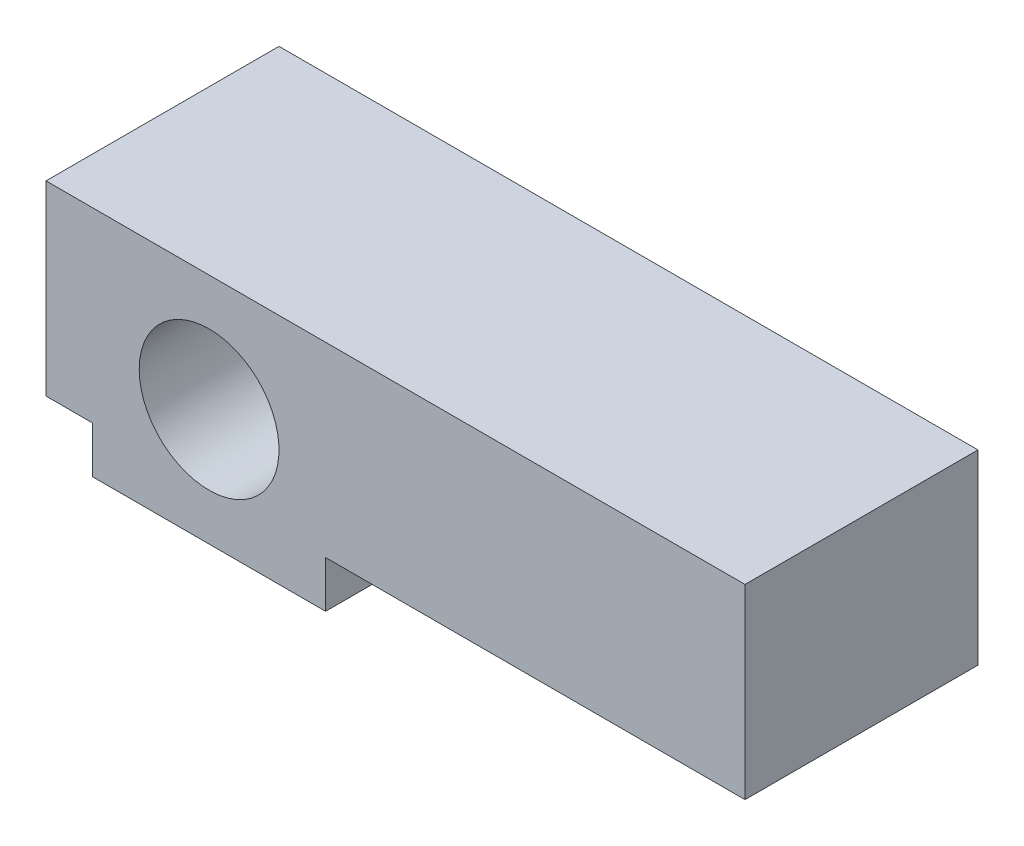
ISO-10303-21;
HEADER;
FILE_DESCRIPTION(('STEP AP214'),'2;1');
FILE_NAME('part.step','',(''),(''),'','','');
FILE_SCHEMA(('AUTOMOTIVE_DESIGN { 1 0 10303 214 1 1 1 1 }'));
ENDSEC;
DATA;
#1=APPLICATION_CONTEXT('core data for automotive mechanical design processes');
#2=APPLICATION_PROTOCOL_DEFINITION('international standard','automotive_design',2000,#1);
#3=PRODUCT_CONTEXT('',#1,'mechanical');
#4=PRODUCT('Part','Part','',(#3));
#5=PRODUCT_RELATED_PRODUCT_CATEGORY('part','',(#4));
#6=PRODUCT_DEFINITION_FORMATION('','',#4);
#7=PRODUCT_DEFINITION_CONTEXT('part definition',#1,'design');
#8=PRODUCT_DEFINITION('design','',#6,#7);
#9=PRODUCT_DEFINITION_SHAPE('','',#8);
#10=(LENGTH_UNIT() NAMED_UNIT(*) SI_UNIT(.MILLI.,.METRE.));
#11=(NAMED_UNIT(*) PLANE_ANGLE_UNIT() SI_UNIT($,.RADIAN.));
#12=(NAMED_UNIT(*) SI_UNIT($,.STERADIAN.) SOLID_ANGLE_UNIT());
#13=UNCERTAINTY_MEASURE_WITH_UNIT(LENGTH_MEASURE(1.E-05),#10,'distance_accuracy_value','');
#14=(GEOMETRIC_REPRESENTATION_CONTEXT(3) GLOBAL_UNCERTAINTY_ASSIGNED_CONTEXT((#13)) GLOBAL_UNIT_ASSIGNED_CONTEXT((#10,
#11,#12)) REPRESENTATION_CONTEXT('',''));
#15=CARTESIAN_POINT('',(0.,0.,0.));
#16=DIRECTION('',(0.,0.,1.));
#17=DIRECTION('',(1.,0.,0.));
#18=AXIS2_PLACEMENT_3D('',#15,#16,#17);
#19=CARTESIAN_POINT('',(-14.,-8.,85.));
#20=DIRECTION('',(1.,0.,0.));
#21=DIRECTION('',(0.,1.,0.));
#22=AXIS2_PLACEMENT_3D('',#19,#20,#21);
#23=PLANE('',#22);
#24=DIRECTION('',(0.,1.,0.));
#25=VECTOR('',#24,1.);
#26=CARTESIAN_POINT('',(-14.,-8.,95.));
#27=LINE('',#26,#25);
#28=CARTESIAN_POINT('',(-14.,-8.,95.));
#29=VERTEX_POINT('',#28);
#30=CARTESIAN_POINT('',(-14.,0.,95.));
#31=VERTEX_POINT('',#30);
#32=EDGE_CURVE('E122',#29,#31,#27,.T.);
#33=ORIENTED_EDGE('',*,*,#32,.T.);
#34=DIRECTION('',(0.,0.,1.));
#35=VECTOR('',#34,1.);
#36=CARTESIAN_POINT('',(-14.,0.,85.));
#37=LINE('',#36,#35);
#38=CARTESIAN_POINT('',(-14.,0.,85.));
#39=VERTEX_POINT('',#38);
#40=EDGE_CURVE('E11',#39,#31,#37,.T.);
#41=ORIENTED_EDGE('',*,*,#40,.F.);
#42=DIRECTION('',(0.,1.,0.));
#43=VECTOR('',#42,1.);
#44=CARTESIAN_POINT('',(-14.,-8.,85.));
#45=LINE('',#44,#43);
#46=CARTESIAN_POINT('',(-14.,-8.,85.));
#47=VERTEX_POINT('',#46);
#48=EDGE_CURVE('E136',#47,#39,#45,.T.);
#49=ORIENTED_EDGE('',*,*,#48,.F.);
#50=DIRECTION('',(0.,0.,1.));
#51=VECTOR('',#50,1.);
#52=CARTESIAN_POINT('',(-14.,-8.,85.));
#53=LINE('',#52,#51);
#54=EDGE_CURVE('E118',#47,#29,#53,.T.);
#55=ORIENTED_EDGE('',*,*,#54,.T.);
#56=EDGE_LOOP('',(#33,#41,#49,#55));
#57=FACE_BOUND('',#56,.T.);
#58=ADVANCED_FACE('F34',(#57),#23,.F.);
#59=CARTESIAN_POINT('',(-14.,0.,85.));
#60=DIRECTION('',(0.,-1.,0.));
#61=DIRECTION('',(1.,0.,0.));
#62=AXIS2_PLACEMENT_3D('',#59,#60,#61);
#63=PLANE('',#62);
#64=DIRECTION('',(1.,0.,0.));
#65=VECTOR('',#64,1.);
#66=CARTESIAN_POINT('',(-14.,0.,95.));
#67=LINE('',#66,#65);
#68=CARTESIAN_POINT('',(16.,0.,95.));
#69=VERTEX_POINT('',#68);
#70=EDGE_CURVE('E125',#31,#69,#67,.T.);
#71=ORIENTED_EDGE('',*,*,#70,.T.);
#72=DIRECTION('',(0.,0.,1.));
#73=VECTOR('',#72,1.);
#74=CARTESIAN_POINT('',(16.,0.,85.));
#75=LINE('',#74,#73);
#76=CARTESIAN_POINT('',(16.,0.,85.));
#77=VERTEX_POINT('',#76);
#78=EDGE_CURVE('E248',#77,#69,#75,.T.);
#79=ORIENTED_EDGE('',*,*,#78,.F.);
#80=DIRECTION('',(1.,0.,0.));
#81=VECTOR('',#80,1.);
#82=CARTESIAN_POINT('',(-14.,0.,85.));
#83=LINE('',#82,#81);
#84=EDGE_CURVE('E88',#39,#77,#83,.T.);
#85=ORIENTED_EDGE('',*,*,#84,.F.);
#86=ORIENTED_EDGE('',*,*,#40,.T.);
#87=EDGE_LOOP('',(#71,#79,#85,#86));
#88=FACE_BOUND('',#87,.T.);
#89=ADVANCED_FACE('F168',(#88),#63,.F.);
#90=CARTESIAN_POINT('',(0.,-8.,85.));
#91=DIRECTION('',(0.,1.,0.));
#92=DIRECTION('',(0.,0.,1.));
#93=AXIS2_PLACEMENT_3D('',#90,#91,#92);
#94=PLANE('',#93);
#95=DIRECTION('',(-1.,0.,0.));
#96=VECTOR('',#95,1.);
#97=CARTESIAN_POINT('',(0.,-8.,95.));
#98=LINE('',#97,#96);
#99=CARTESIAN_POINT('',(16.,-8.,95.));
#100=VERTEX_POINT('',#99);
#101=CARTESIAN_POINT('',(-2.,-8.,95.));
#102=VERTEX_POINT('',#101);
#103=EDGE_CURVE('E129',#100,#102,#98,.T.);
#104=ORIENTED_EDGE('',*,*,#103,.T.);
#105=DIRECTION('',(0.,0.,1.));
#106=VECTOR('',#105,1.);
#107=CARTESIAN_POINT('',(-2.,-8.,85.));
#108=LINE('',#107,#106);
#109=CARTESIAN_POINT('',(-2.,-8.,85.));
#110=VERTEX_POINT('',#109);
#111=EDGE_CURVE('E42',#110,#102,#108,.T.);
#112=ORIENTED_EDGE('',*,*,#111,.F.);
#113=DIRECTION('',(-1.,0.,0.));
#114=VECTOR('',#113,1.);
#115=CARTESIAN_POINT('',(0.,-8.,85.));
#116=LINE('',#115,#114);
#117=CARTESIAN_POINT('',(16.,-8.,85.));
#118=VERTEX_POINT('',#117);
#119=EDGE_CURVE('E268',#118,#110,#116,.T.);
#120=ORIENTED_EDGE('',*,*,#119,.F.);
#121=DIRECTION('',(0.,0.,-1.));
#122=VECTOR('',#121,1.);
#123=CARTESIAN_POINT('',(16.,-8.,95.));
#124=LINE('',#123,#122);
#125=EDGE_CURVE('E256',#100,#118,#124,.T.);
#126=ORIENTED_EDGE('',*,*,#125,.F.);
#127=EDGE_LOOP('',(#104,#112,#120,#126));
#128=FACE_BOUND('',#127,.T.);
#129=ADVANCED_FACE('F172',(#128),#94,.F.);
#130=CARTESIAN_POINT('',(-2.,-8.,85.));
#131=DIRECTION('',(-1.,0.,0.));
#132=DIRECTION('',(0.,-1.,0.));
#133=AXIS2_PLACEMENT_3D('',#130,#131,#132);
#134=PLANE('',#133);
#135=DIRECTION('',(0.,-1.,0.));
#136=VECTOR('',#135,1.);
#137=CARTESIAN_POINT('',(-2.,-8.,95.));
#138=LINE('',#137,#136);
#139=CARTESIAN_POINT('',(-2.,-10.,95.));
#140=VERTEX_POINT('',#139);
#141=EDGE_CURVE('E131',#102,#140,#138,.T.);
#142=ORIENTED_EDGE('',*,*,#141,.T.);
#143=DIRECTION('',(0.,0.,1.));
#144=VECTOR('',#143,1.);
#145=CARTESIAN_POINT('',(-2.,-10.,85.));
#146=LINE('',#145,#144);
#147=CARTESIAN_POINT('',(-2.,-10.,85.));
#148=VERTEX_POINT('',#147);
#149=EDGE_CURVE('E113',#148,#140,#146,.T.);
#150=ORIENTED_EDGE('',*,*,#149,.F.);
#151=DIRECTION('',(0.,-1.,0.));
#152=VECTOR('',#151,1.);
#153=CARTESIAN_POINT('',(-2.,-8.,85.));
#154=LINE('',#153,#152);
#155=EDGE_CURVE('E104',#110,#148,#154,.T.);
#156=ORIENTED_EDGE('',*,*,#155,.F.);
#157=ORIENTED_EDGE('',*,*,#111,.T.);
#158=EDGE_LOOP('',(#142,#150,#156,#157));
#159=FACE_BOUND('',#158,.T.);
#160=ADVANCED_FACE('F143',(#159),#134,.F.);
#161=CARTESIAN_POINT('',(-2.,-10.,85.));
#162=DIRECTION('',(0.,1.,0.));
#163=DIRECTION('',(0.,0.,1.));
#164=AXIS2_PLACEMENT_3D('',#161,#162,#163);
#165=PLANE('',#164);
#166=DIRECTION('',(-1.,0.,0.));
#167=VECTOR('',#166,1.);
#168=CARTESIAN_POINT('',(-2.,-10.,95.));
#169=LINE('',#168,#167);
#170=CARTESIAN_POINT('',(-12.,-10.,95.));
#171=VERTEX_POINT('',#170);
#172=EDGE_CURVE('E112',#140,#171,#169,.T.);
#173=ORIENTED_EDGE('',*,*,#172,.T.);
#174=DIRECTION('',(0.,0.,1.));
#175=VECTOR('',#174,1.);
#176=CARTESIAN_POINT('',(-12.,-10.,85.));
#177=LINE('',#176,#175);
#178=CARTESIAN_POINT('',(-12.,-10.,85.));
#179=VERTEX_POINT('',#178);
#180=EDGE_CURVE('E109',#179,#171,#177,.T.);
#181=ORIENTED_EDGE('',*,*,#180,.F.);
#182=DIRECTION('',(-1.,0.,0.));
#183=VECTOR('',#182,1.);
#184=CARTESIAN_POINT('',(-2.,-10.,85.));
#185=LINE('',#184,#183);
#186=EDGE_CURVE('E98',#148,#179,#185,.T.);
#187=ORIENTED_EDGE('',*,*,#186,.F.);
#188=ORIENTED_EDGE('',*,*,#149,.T.);
#189=EDGE_LOOP('',(#173,#181,#187,#188));
#190=FACE_BOUND('',#189,.T.);
#191=ADVANCED_FACE('F110',(#190),#165,.F.);
#192=CARTESIAN_POINT('',(-12.,-10.,85.));
#193=DIRECTION('',(1.,0.,0.));
#194=DIRECTION('',(0.,0.,-1.));
#195=AXIS2_PLACEMENT_3D('',#192,#193,#194);
#196=PLANE('',#195);
#197=DIRECTION('',(0.,1.,0.));
#198=VECTOR('',#197,1.);
#199=CARTESIAN_POINT('',(-12.,-10.,95.));
#200=LINE('',#199,#198);
#201=CARTESIAN_POINT('',(-12.,-8.,95.));
#202=VERTEX_POINT('',#201);
#203=EDGE_CURVE('E74',#171,#202,#200,.T.);
#204=ORIENTED_EDGE('',*,*,#203,.T.);
#205=DIRECTION('',(0.,0.,1.));
#206=VECTOR('',#205,1.);
#207=CARTESIAN_POINT('',(-12.,-8.,85.));
#208=LINE('',#207,#206);
#209=CARTESIAN_POINT('',(-12.,-8.,85.));
#210=VERTEX_POINT('',#209);
#211=EDGE_CURVE('E114',#210,#202,#208,.T.);
#212=ORIENTED_EDGE('',*,*,#211,.F.);
#213=DIRECTION('',(0.,1.,0.));
#214=VECTOR('',#213,1.);
#215=CARTESIAN_POINT('',(-12.,-10.,85.));
#216=LINE('',#215,#214);
#217=EDGE_CURVE('E102',#179,#210,#216,.T.);
#218=ORIENTED_EDGE('',*,*,#217,.F.);
#219=ORIENTED_EDGE('',*,*,#180,.T.);
#220=EDGE_LOOP('',(#204,#212,#218,#219));
#221=FACE_BOUND('',#220,.T.);
#222=ADVANCED_FACE('F116',(#221),#196,.F.);
#223=CARTESIAN_POINT('',(-12.,-8.,85.));
#224=DIRECTION('',(0.,1.,0.));
#225=DIRECTION('',(0.,0.,1.));
#226=AXIS2_PLACEMENT_3D('',#223,#224,#225);
#227=PLANE('',#226);
#228=DIRECTION('',(-1.,0.,0.));
#229=VECTOR('',#228,1.);
#230=CARTESIAN_POINT('',(-12.,-8.,95.));
#231=LINE('',#230,#229);
#232=EDGE_CURVE('E80',#202,#29,#231,.T.);
#233=ORIENTED_EDGE('',*,*,#232,.T.);
#234=ORIENTED_EDGE('',*,*,#54,.F.);
#235=DIRECTION('',(-1.,0.,0.));
#236=VECTOR('',#235,1.);
#237=CARTESIAN_POINT('',(-12.,-8.,85.));
#238=LINE('',#237,#236);
#239=EDGE_CURVE('E50',#210,#47,#238,.T.);
#240=ORIENTED_EDGE('',*,*,#239,.F.);
#241=ORIENTED_EDGE('',*,*,#211,.T.);
#242=EDGE_LOOP('',(#233,#234,#240,#241));
#243=FACE_BOUND('',#242,.T.);
#244=ADVANCED_FACE('F156',(#243),#227,.F.);
#245=CARTESIAN_POINT('',(0.,0.,85.));
#246=DIRECTION('',(0.,0.,-1.));
#247=DIRECTION('',(-1.,0.,0.));
#248=AXIS2_PLACEMENT_3D('',#245,#246,#247);
#249=PLANE('',#248);
#250=CARTESIAN_POINT('',(-7.,-5.,85.));
#251=DIRECTION('',(0.,0.,-1.));
#252=DIRECTION('',(-1.,0.,0.));
#253=AXIS2_PLACEMENT_3D('',#250,#251,#252);
#254=CIRCLE('',#253,3.);
#255=CARTESIAN_POINT('',(-10.,-5.,85.));
#256=VERTEX_POINT('',#255);
#257=EDGE_CURVE('E261',#256,#256,#254,.T.);
#258=ORIENTED_EDGE('',*,*,#257,.F.);
#259=EDGE_LOOP('',(#258));
#260=FACE_BOUND('',#259,.T.);
#261=ORIENTED_EDGE('',*,*,#48,.T.);
#262=ORIENTED_EDGE('',*,*,#84,.T.);
#263=DIRECTION('',(0.,1.,0.));
#264=VECTOR('',#263,1.);
#265=CARTESIAN_POINT('',(16.,-8.,85.));
#266=LINE('',#265,#264);
#267=EDGE_CURVE('E253',#118,#77,#266,.T.);
#268=ORIENTED_EDGE('',*,*,#267,.F.);
#269=ORIENTED_EDGE('',*,*,#119,.T.);
#270=ORIENTED_EDGE('',*,*,#155,.T.);
#271=ORIENTED_EDGE('',*,*,#186,.T.);
#272=ORIENTED_EDGE('',*,*,#217,.T.);
#273=ORIENTED_EDGE('',*,*,#239,.T.);
#274=EDGE_LOOP('',(#261,#262,#268,#269,#270,#271,#272,#273));
#275=FACE_BOUND('',#274,.T.);
#276=ADVANCED_FACE('F100',(#260,#275),#249,.T.);
#277=CARTESIAN_POINT('',(0.,0.,95.));
#278=DIRECTION('',(0.,0.,-1.));
#279=DIRECTION('',(-1.,0.,0.));
#280=AXIS2_PLACEMENT_3D('',#277,#278,#279);
#281=PLANE('',#280);
#282=CARTESIAN_POINT('',(-7.,-5.,95.));
#283=DIRECTION('',(0.,0.,-1.));
#284=DIRECTION('',(-1.,0.,0.));
#285=AXIS2_PLACEMENT_3D('',#282,#283,#284);
#286=CIRCLE('',#285,3.);
#287=CARTESIAN_POINT('',(-10.,-5.,95.));
#288=VERTEX_POINT('',#287);
#289=EDGE_CURVE('E126',#288,#288,#286,.F.);
#290=ORIENTED_EDGE('',*,*,#289,.F.);
#291=EDGE_LOOP('',(#290));
#292=FACE_BOUND('',#291,.T.);
#293=ORIENTED_EDGE('',*,*,#32,.F.);
#294=ORIENTED_EDGE('',*,*,#232,.F.);
#295=ORIENTED_EDGE('',*,*,#203,.F.);
#296=ORIENTED_EDGE('',*,*,#172,.F.);
#297=ORIENTED_EDGE('',*,*,#141,.F.);
#298=ORIENTED_EDGE('',*,*,#103,.F.);
#299=DIRECTION('',(0.,-1.,0.));
#300=VECTOR('',#299,1.);
#301=CARTESIAN_POINT('',(16.,0.,95.));
#302=LINE('',#301,#300);
#303=EDGE_CURVE('E250',#69,#100,#302,.T.);
#304=ORIENTED_EDGE('',*,*,#303,.F.);
#305=ORIENTED_EDGE('',*,*,#70,.F.);
#306=EDGE_LOOP('',(#293,#294,#295,#296,#297,#298,#304,#305));
#307=FACE_BOUND('',#306,.T.);
#308=ADVANCED_FACE('F149',(#292,#307),#281,.F.);
#309=CARTESIAN_POINT('',(-7.,-5.,95.001));
#310=DIRECTION('',(0.,0.,-1.));
#311=DIRECTION('',(-1.,0.,0.));
#312=AXIS2_PLACEMENT_3D('',#309,#310,#311);
#313=CYLINDRICAL_SURFACE('',#312,3.);
#314=ORIENTED_EDGE('',*,*,#257,.T.);
#315=EDGE_LOOP('',(#314));
#316=FACE_BOUND('',#315,.T.);
#317=ORIENTED_EDGE('',*,*,#289,.T.);
#318=EDGE_LOOP('',(#317));
#319=FACE_BOUND('',#318,.T.);
#320=ADVANCED_FACE('F199',(#316,#319),#313,.F.);
#321=CARTESIAN_POINT('',(16.,0.,0.));
#322=DIRECTION('',(1.,0.,0.));
#323=DIRECTION('',(0.,1.,0.));
#324=AXIS2_PLACEMENT_3D('',#321,#322,#323);
#325=PLANE('',#324);
#326=ORIENTED_EDGE('',*,*,#78,.T.);
#327=ORIENTED_EDGE('',*,*,#303,.T.);
#328=ORIENTED_EDGE('',*,*,#125,.T.);
#329=ORIENTED_EDGE('',*,*,#267,.T.);
#330=EDGE_LOOP('',(#326,#327,#328,#329));
#331=FACE_BOUND('',#330,.T.);
#332=ADVANCED_FACE('F203',(#331),#325,.T.);
#333=CLOSED_SHELL('',(#58,#89,#129,#160,#191,#222,#244,#276,#308,#320,#332));
#334=MANIFOLD_SOLID_BREP('B2',#333);
#335=ADVANCED_BREP_SHAPE_REPRESENTATION('',(#18,#334),#14);
#336=SHAPE_DEFINITION_REPRESENTATION(#9,#335);
ENDSEC;
END-ISO-10303-21;
